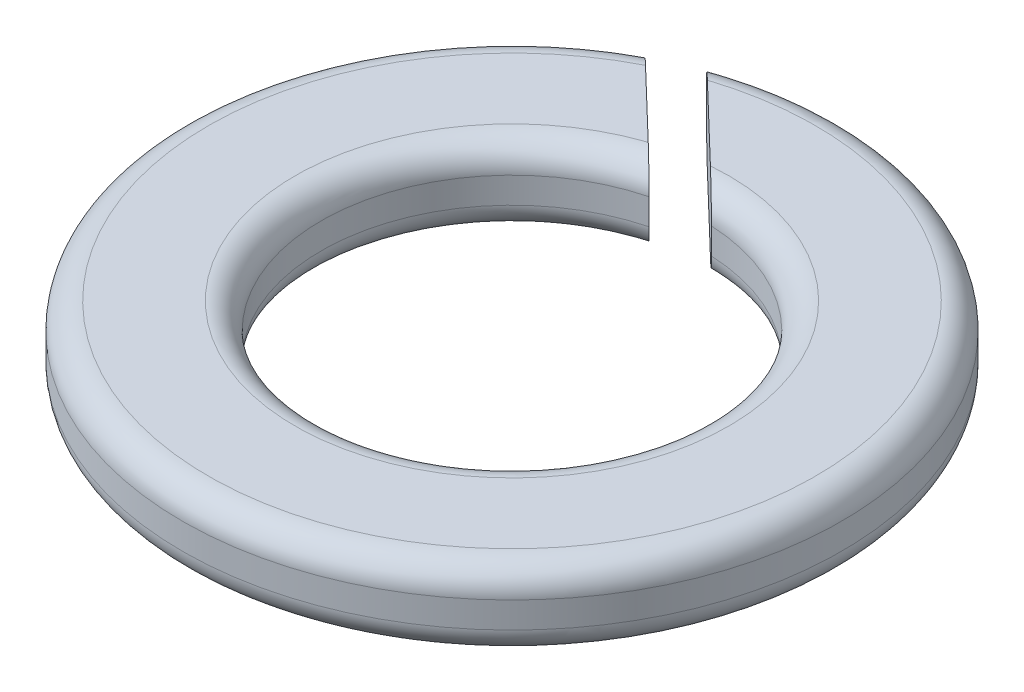
ISO-10303-21;
HEADER;
FILE_DESCRIPTION(('STEP AP214'),'2;1');
FILE_NAME('part.step','',(''),(''),'','','');
FILE_SCHEMA(('AUTOMOTIVE_DESIGN { 1 0 10303 214 1 1 1 1 }'));
ENDSEC;
DATA;
#1=APPLICATION_CONTEXT('core data for automotive mechanical design processes');
#2=APPLICATION_PROTOCOL_DEFINITION('international standard','automotive_design',2000,#1);
#3=PRODUCT_CONTEXT('',#1,'mechanical');
#4=PRODUCT('Part','Part','',(#3));
#5=PRODUCT_RELATED_PRODUCT_CATEGORY('part','',(#4));
#6=PRODUCT_DEFINITION_FORMATION('','',#4);
#7=PRODUCT_DEFINITION_CONTEXT('part definition',#1,'design');
#8=PRODUCT_DEFINITION('design','',#6,#7);
#9=PRODUCT_DEFINITION_SHAPE('','',#8);
#10=(LENGTH_UNIT() NAMED_UNIT(*) SI_UNIT(.MILLI.,.METRE.));
#11=(NAMED_UNIT(*) PLANE_ANGLE_UNIT() SI_UNIT($,.RADIAN.));
#12=(NAMED_UNIT(*) SI_UNIT($,.STERADIAN.) SOLID_ANGLE_UNIT());
#13=UNCERTAINTY_MEASURE_WITH_UNIT(LENGTH_MEASURE(1.E-05),#10,'distance_accuracy_value','');
#14=(GEOMETRIC_REPRESENTATION_CONTEXT(3) GLOBAL_UNCERTAINTY_ASSIGNED_CONTEXT((#13)) GLOBAL_UNIT_ASSIGNED_CONTEXT((#10,
#11,#12)) REPRESENTATION_CONTEXT('',''));
#15=CARTESIAN_POINT('',(0.,0.,0.));
#16=DIRECTION('',(0.,0.,1.));
#17=DIRECTION('',(1.,0.,0.));
#18=AXIS2_PLACEMENT_3D('',#15,#16,#17);
#19=CARTESIAN_POINT('',(0.593322217837906,0.,-1.0328610161791));
#20=DIRECTION('',(-0.692531828189712,0.,0.721387321030953));
#21=DIRECTION('',(0.,1.,0.));
#22=AXIS2_PLACEMENT_3D('',#19,#20,#21);
#23=PLANE('',#22);
#24=CARTESIAN_POINT('',(-0.549745919114708,0.3,-2.1302064276536));
#25=CARTESIAN_POINT('',(-0.549745919114708,0.238292872043772,-2.1302064276536));
#26=CARTESIAN_POINT('',(-0.571810228670032,0.178640490645868,-2.15138816482671));
#27=CARTESIAN_POINT('',(-0.592207092247999,0.123496164356241,-2.17096915386156));
#28=CARTESIAN_POINT('',(-0.629338967775897,0.0813366596468253,-2.20661575436834));
#29=CARTESIAN_POINT('',(-0.700976021927212,0.,-2.27538732635361));
#30=CARTESIAN_POINT('',(-0.798530547889687,0.,-2.36903967127758));
#31=B_SPLINE_CURVE_WITH_KNOTS('',2,(#24,#25,#26,#27,#28,#29,#30),.UNSPECIFIED.,.F.,.F.,(3,2,2,
3),(0.,0.25,0.5,1.),.UNSPECIFIED.);
#32=CARTESIAN_POINT('',(-0.549745919114707,0.3,-2.13020642765361));
#33=VERTEX_POINT('',#32);
#34=CARTESIAN_POINT('',(-0.798530547889687,0.,-2.36903967127758));
#35=VERTEX_POINT('',#34);
#36=EDGE_CURVE('E130',#33,#35,#31,.T.);
#37=ORIENTED_EDGE('',*,*,#36,.T.);
#38=DIRECTION('',(0.721387321030953,0.,0.692531828189712));
#39=VECTOR('',#38,1.);
#40=CARTESIAN_POINT('',(0.593322217837906,0.,-1.0328610161791));
#41=LINE('',#40,#39);
#42=CARTESIAN_POINT('',(-1.58260840657755,0.,-3.12175441561793));
#43=VERTEX_POINT('',#42);
#44=EDGE_CURVE('E127',#43,#35,#41,.T.);
#45=ORIENTED_EDGE('',*,*,#44,.F.);
#46=CARTESIAN_POINT('',(-1.58260840657755,0.,-3.12175441561793));
#47=CARTESIAN_POINT('',(-1.62616472047488,0.,-3.16356847695937));
#48=CARTESIAN_POINT('',(-1.66788251234681,0.0217214850961454,-3.20361755715641));
#49=CARTESIAN_POINT('',(-1.70888620140039,0.0430711534438573,-3.24298109864785));
#50=CARTESIAN_POINT('',(-1.74179588572183,0.084782734309142,-3.27457439559644));
#51=CARTESIAN_POINT('',(-1.77374416978038,0.125275782525553,-3.30524474829264));
#52=CARTESIAN_POINT('',(-1.79245412222487,0.182479272243945,-3.32320630263936));
#53=CARTESIAN_POINT('',(-1.81079363724819,0.238550192904411,-3.34081223706174));
#54=CARTESIAN_POINT('',(-1.81079363724819,0.3,-3.34081223706174));
#55=B_SPLINE_CURVE_WITH_KNOTS('',2,(#46,#47,#48,#49,#50,#51,#52,#53,#54),.UNSPECIFIED.,.F.,.F.,
(3,2,2,2,3),(0.,0.25,0.5,0.75,1.),.UNSPECIFIED.);
#56=CARTESIAN_POINT('',(-1.81079363724819,0.3,-3.34081223706174));
#57=VERTEX_POINT('',#56);
#58=EDGE_CURVE('E106',#43,#57,#55,.T.);
#59=ORIENTED_EDGE('',*,*,#58,.T.);
#60=DIRECTION('',(0.,-1.,0.));
#61=VECTOR('',#60,1.);
#62=CARTESIAN_POINT('',(-1.81079363724819,0.9,-3.34081223706174));
#63=LINE('',#62,#61);
#64=CARTESIAN_POINT('',(-1.81079363724819,0.6,-3.34081223706174));
#65=VERTEX_POINT('',#64);
#66=EDGE_CURVE('E257',#65,#57,#63,.T.);
#67=ORIENTED_EDGE('',*,*,#66,.F.);
#68=CARTESIAN_POINT('',(-1.81079363724819,0.6,-3.34081223706174));
#69=CARTESIAN_POINT('',(-1.81079363724819,0.659869786955904,-3.34081223706174));
#70=CARTESIAN_POINT('',(-1.79230807118462,0.717676118581319,-3.32306609364071));
#71=CARTESIAN_POINT('',(-1.7747236083619,0.772664604510765,-3.3061850093309));
#72=CARTESIAN_POINT('',(-1.74186074312703,0.815134271742733,-3.27463665870543));
#73=CARTESIAN_POINT('',(-1.71097715379939,0.855046061305205,-3.2449884129509));
#74=CARTESIAN_POINT('',(-1.66808237769919,0.878025014819113,-3.20380942789471));
#75=CARTESIAN_POINT('',(-1.62706170769484,0.9,-3.16442958469053));
#76=CARTESIAN_POINT('',(-1.58260840657755,0.9,-3.12175441561793));
#77=B_SPLINE_CURVE_WITH_KNOTS('',2,(#68,#69,#70,#71,#72,#73,#74,#75,#76),.UNSPECIFIED.,.F.,.F.,
(3,2,2,2,3),(0.,0.25,0.5,0.75,1.),.UNSPECIFIED.);
#78=CARTESIAN_POINT('',(-1.58260840657755,0.9,-3.12175441561793));
#79=VERTEX_POINT('',#78);
#80=EDGE_CURVE('E31',#65,#79,#77,.T.);
#81=ORIENTED_EDGE('',*,*,#80,.T.);
#82=DIRECTION('',(0.721387321030953,0.,0.692531828189712));
#83=VECTOR('',#82,1.);
#84=CARTESIAN_POINT('',(0.593322217837906,0.9,-1.0328610161791));
#85=LINE('',#84,#83);
#86=CARTESIAN_POINT('',(-0.798530547889687,0.9,-2.36903967127758));
#87=VERTEX_POINT('',#86);
#88=EDGE_CURVE('E273',#79,#87,#85,.T.);
#89=ORIENTED_EDGE('',*,*,#88,.T.);
#90=CARTESIAN_POINT('',(-0.798530547889687,0.9,-2.36903967127758));
#91=CARTESIAN_POINT('',(-0.702398788135294,0.9,-2.27675318191337));
#92=CARTESIAN_POINT('',(-0.629482383991013,0.81882452792996,-2.20675343393486));
#93=CARTESIAN_POINT('',(-0.593840935798757,0.779146057547061,-2.17253764367029));
#94=CARTESIAN_POINT('',(-0.571988208982686,0.721663595731595,-2.15155902592686));
#95=CARTESIAN_POINT('',(-0.549745919114708,0.663156408560589,-2.1302064276536));
#96=CARTESIAN_POINT('',(-0.549745919114708,0.6,-2.1302064276536));
#97=B_SPLINE_CURVE_WITH_KNOTS('',2,(#90,#91,#92,#93,#94,#95,#96),.UNSPECIFIED.,.F.,.F.,(3,2,2,
3),(0.,0.5,0.75,1.),.UNSPECIFIED.);
#98=CARTESIAN_POINT('',(-0.549745919114708,0.6,-2.13020642765361));
#99=VERTEX_POINT('',#98);
#100=EDGE_CURVE('E195',#87,#99,#97,.T.);
#101=ORIENTED_EDGE('',*,*,#100,.T.);
#102=DIRECTION('',(0.,-1.,0.));
#103=VECTOR('',#102,1.);
#104=CARTESIAN_POINT('',(-0.549745919114707,0.9,-2.13020642765361));
#105=LINE('',#104,#103);
#106=EDGE_CURVE('E200',#99,#33,#105,.T.);
#107=ORIENTED_EDGE('',*,*,#106,.T.);
#108=EDGE_LOOP('',(#37,#45,#59,#67,#81,#89,#101,#107));
#109=FACE_BOUND('',#108,.T.);
#110=ADVANCED_FACE('F17',(#109),#23,.F.);
#111=CARTESIAN_POINT('',(0.939588131932762,0.,-1.39355467669457));
#112=DIRECTION('',(0.692531828189712,0.,-0.721387321030953));
#113=DIRECTION('',(0.,-1.,0.));
#114=AXIS2_PLACEMENT_3D('',#111,#112,#113);
#115=PLANE('',#114);
#116=CARTESIAN_POINT('',(-0.204253008051566,0.,-2.49164217107952));
#117=CARTESIAN_POINT('',(-0.0969567383931656,0.,-2.38863775220746));
#118=CARTESIAN_POINT('',(-0.00861649510193875,0.0730108119148995,-2.30383111864788));
#119=CARTESIAN_POINT('',(0.038678053008725,0.112098471491797,-2.25842835246165));
#120=CARTESIAN_POINT('',(0.068260683071186,0.167039328004714,-2.23002902760168));
#121=CARTESIAN_POINT('',(0.102005583355745,0.229710352205813,-2.19763392332851));
#122=CARTESIAN_POINT('',(0.102005583355745,0.3,-2.19763392332851));
#123=B_SPLINE_CURVE_WITH_KNOTS('',2,(#116,#117,#118,#119,#120,#121,#122),.UNSPECIFIED.,.F.,.F.,
(3,2,2,3),(0.,0.5,0.75,1.),.UNSPECIFIED.);
#124=CARTESIAN_POINT('',(-0.204253008051564,0.,-2.49164217107952));
#125=VERTEX_POINT('',#124);
#126=CARTESIAN_POINT('',(0.102005583355745,0.3,-2.19763392332851));
#127=VERTEX_POINT('',#126);
#128=EDGE_CURVE('E45',#125,#127,#123,.T.);
#129=ORIENTED_EDGE('',*,*,#128,.T.);
#130=DIRECTION('',(0.,1.,0.));
#131=VECTOR('',#130,1.);
#132=CARTESIAN_POINT('',(0.102005583355745,0.9,-2.19763392332851));
#133=LINE('',#132,#131);
#134=CARTESIAN_POINT('',(0.102005583355743,0.6,-2.19763392332851));
#135=VERTEX_POINT('',#134);
#136=EDGE_CURVE('E222',#127,#135,#133,.T.);
#137=ORIENTED_EDGE('',*,*,#136,.T.);
#138=CARTESIAN_POINT('',(0.102005583355742,0.6,-2.19763392332851));
#139=CARTESIAN_POINT('',(0.102005583355742,0.668594130341303,-2.19763392332851));
#140=CARTESIAN_POINT('',(0.0684107004835456,0.73267844156295,-2.22988501088582));
#141=CARTESIAN_POINT('',(0.0407480877060247,0.785446581674718,-2.25644111915224));
#142=CARTESIAN_POINT('',(-0.00830269652094082,0.826727519443401,-2.30352987201013));
#143=CARTESIAN_POINT('',(-0.0953664316932296,0.9,-2.38711105777552));
#144=CARTESIAN_POINT('',(-0.204253008051566,0.9,-2.49164217107952));
#145=B_SPLINE_CURVE_WITH_KNOTS('',2,(#138,#139,#140,#141,#142,#143,#144),.UNSPECIFIED.,.F.,.F.,
(3,2,2,3),(0.,0.25,0.5,1.),.UNSPECIFIED.);
#146=CARTESIAN_POINT('',(-0.204253008051564,0.9,-2.49164217107952));
#147=VERTEX_POINT('',#146);
#148=EDGE_CURVE('E123',#135,#147,#145,.T.);
#149=ORIENTED_EDGE('',*,*,#148,.T.);
#150=DIRECTION('',(-0.721387321030953,0.,-0.692531828189712));
#151=VECTOR('',#150,1.);
#152=CARTESIAN_POINT('',(0.939588131932762,0.9,-1.39355467669457));
#153=LINE('',#152,#151);
#154=CARTESIAN_POINT('',(-1.07754268781631,0.9,-3.33000026365368));
#155=VERTEX_POINT('',#154);
#156=EDGE_CURVE('E149',#147,#155,#153,.T.);
#157=ORIENTED_EDGE('',*,*,#156,.T.);
#158=CARTESIAN_POINT('',(-1.07754268781631,0.9,-3.33000026365368));
#159=CARTESIAN_POINT('',(-1.17387298271746,0.9,-3.42247734675878));
#160=CARTESIAN_POINT('',(-1.24430597083907,0.818776308156964,-3.49009301535552));
#161=CARTESIAN_POINT('',(-1.27901853511499,0.778745596710211,-3.5234170770604));
#162=CARTESIAN_POINT('',(-1.29977581164189,0.720860874968146,-3.54334406252623));
#163=CARTESIAN_POINT('',(-1.32045840262741,0.663184424854354,-3.56319934987234));
#164=CARTESIAN_POINT('',(-1.32045840262741,0.6,-3.56319934987234));
#165=B_SPLINE_CURVE_WITH_KNOTS('',2,(#158,#159,#160,#161,#162,#163,#164),.UNSPECIFIED.,.F.,.F.,
(3,2,2,3),(0.,0.5,0.75,1.),.UNSPECIFIED.);
#166=CARTESIAN_POINT('',(-1.32045840262742,0.6,-3.56319934987234));
#167=VERTEX_POINT('',#166);
#168=EDGE_CURVE('E11',#155,#167,#165,.T.);
#169=ORIENTED_EDGE('',*,*,#168,.T.);
#170=DIRECTION('',(0.,1.,0.));
#171=VECTOR('',#170,1.);
#172=CARTESIAN_POINT('',(-1.32045840262742,0.9,-3.56319934987234));
#173=LINE('',#172,#171);
#174=CARTESIAN_POINT('',(-1.32045840262742,0.3,-3.56319934987234));
#175=VERTEX_POINT('',#174);
#176=EDGE_CURVE('E245',#175,#167,#173,.T.);
#177=ORIENTED_EDGE('',*,*,#176,.F.);
#178=CARTESIAN_POINT('',(-1.32045840262742,0.3,-3.56319934987234));
#179=CARTESIAN_POINT('',(-1.32045840262742,0.238495366538767,-3.56319934987234));
#180=CARTESIAN_POINT('',(-1.29973015442705,0.179225734398645,-3.54330023159999));
#181=CARTESIAN_POINT('',(-1.28026374656089,0.123564164633333,-3.52461248004847));
#182=CARTESIAN_POINT('',(-1.2445079377227,0.0814589579590288,-3.49028690356381));
#183=CARTESIAN_POINT('',(-1.21141165698653,0.04248554955834,-3.45851447405708));
#184=CARTESIAN_POINT('',(-1.16646410077022,0.0206156639467661,-3.41536482008943));
#185=CARTESIAN_POINT('',(-1.12409425345409,0.,-3.37468976666595));
#186=CARTESIAN_POINT('',(-1.07754268781631,0.,-3.33000026365368));
#187=B_SPLINE_CURVE_WITH_KNOTS('',2,(#178,#179,#180,#181,#182,#183,#184,#185,#186),
.UNSPECIFIED.,.F.,.F.,(3,2,2,2,3),(0.,0.25,0.5,0.75,1.),.UNSPECIFIED.);
#188=CARTESIAN_POINT('',(-1.07754268781631,0.,-3.33000026365368));
#189=VERTEX_POINT('',#188);
#190=EDGE_CURVE('E93',#175,#189,#187,.T.);
#191=ORIENTED_EDGE('',*,*,#190,.T.);
#192=DIRECTION('',(-0.721387321030953,0.,-0.692531828189712));
#193=VECTOR('',#192,1.);
#194=CARTESIAN_POINT('',(0.939588131932762,0.,-1.39355467669457));
#195=LINE('',#194,#193);
#196=EDGE_CURVE('E140',#125,#189,#195,.T.);
#197=ORIENTED_EDGE('',*,*,#196,.F.);
#198=EDGE_LOOP('',(#129,#137,#149,#157,#169,#177,#191,#197));
#199=FACE_BOUND('',#198,.T.);
#200=ADVANCED_FACE('F19',(#199),#115,.F.);
#201=CARTESIAN_POINT('',(0.,0.6,0.));
#202=DIRECTION('',(0.,1.,0.));
#203=DIRECTION('',(0.,0.,1.));
#204=AXIS2_PLACEMENT_3D('',#201,#202,#203);
#205=TOROIDAL_SURFACE('',#204,3.5,0.3);
#206=ORIENTED_EDGE('',*,*,#80,.F.);
#207=CARTESIAN_POINT('',(0.,0.6,0.));
#208=DIRECTION('',(0.,-1.,0.));
#209=DIRECTION('',(0.,0.,1.));
#210=AXIS2_PLACEMENT_3D('',#207,#208,#209);
#211=CIRCLE('',#210,3.8);
#212=EDGE_CURVE('E265',#167,#65,#211,.T.);
#213=ORIENTED_EDGE('',*,*,#212,.F.);
#214=ORIENTED_EDGE('',*,*,#168,.F.);
#215=CARTESIAN_POINT('',(0.,0.9,0.));
#216=DIRECTION('',(0.,1.,0.));
#217=DIRECTION('',(0.,0.,1.));
#218=AXIS2_PLACEMENT_3D('',#215,#216,#217);
#219=CIRCLE('',#218,3.5);
#220=EDGE_CURVE('E277',#79,#155,#219,.T.);
#221=ORIENTED_EDGE('',*,*,#220,.F.);
#222=EDGE_LOOP('',(#206,#213,#214,#221));
#223=FACE_BOUND('',#222,.T.);
#224=ADVANCED_FACE('F213',(#223),#205,.T.);
#225=CARTESIAN_POINT('',(0.,0.3,0.));
#226=DIRECTION('',(0.,1.,0.));
#227=DIRECTION('',(0.,0.,1.));
#228=AXIS2_PLACEMENT_3D('',#225,#226,#227);
#229=TOROIDAL_SURFACE('',#228,3.5,0.3);
#230=ORIENTED_EDGE('',*,*,#58,.F.);
#231=CARTESIAN_POINT('',(0.,0.,0.));
#232=DIRECTION('',(0.,-1.,0.));
#233=DIRECTION('',(0.,0.,1.));
#234=AXIS2_PLACEMENT_3D('',#231,#232,#233);
#235=CIRCLE('',#234,3.5);
#236=EDGE_CURVE('E118',#189,#43,#235,.T.);
#237=ORIENTED_EDGE('',*,*,#236,.F.);
#238=ORIENTED_EDGE('',*,*,#190,.F.);
#239=CARTESIAN_POINT('',(0.,0.3,0.));
#240=DIRECTION('',(0.,1.,0.));
#241=DIRECTION('',(0.,0.,1.));
#242=AXIS2_PLACEMENT_3D('',#239,#240,#241);
#243=CIRCLE('',#242,3.8);
#244=EDGE_CURVE('E120',#57,#175,#243,.T.);
#245=ORIENTED_EDGE('',*,*,#244,.F.);
#246=EDGE_LOOP('',(#230,#237,#238,#245));
#247=FACE_BOUND('',#246,.T.);
#248=ADVANCED_FACE('F116',(#247),#229,.T.);
#249=CARTESIAN_POINT('',(0.,0.6,0.));
#250=DIRECTION('',(0.,1.,0.));
#251=DIRECTION('',(0.,0.,1.));
#252=AXIS2_PLACEMENT_3D('',#249,#250,#251);
#253=TOROIDAL_SURFACE('',#252,2.5,0.3);
#254=ORIENTED_EDGE('',*,*,#100,.F.);
#255=CARTESIAN_POINT('',(0.,0.9,0.));
#256=DIRECTION('',(0.,-1.,0.));
#257=DIRECTION('',(0.,0.,1.));
#258=AXIS2_PLACEMENT_3D('',#255,#256,#257);
#259=CIRCLE('',#258,2.5);
#260=EDGE_CURVE('E142',#147,#87,#259,.T.);
#261=ORIENTED_EDGE('',*,*,#260,.F.);
#262=ORIENTED_EDGE('',*,*,#148,.F.);
#263=CARTESIAN_POINT('',(0.,0.6,0.));
#264=DIRECTION('',(0.,1.,0.));
#265=DIRECTION('',(0.,0.,1.));
#266=AXIS2_PLACEMENT_3D('',#263,#264,#265);
#267=CIRCLE('',#266,2.2);
#268=EDGE_CURVE('E231',#99,#135,#267,.T.);
#269=ORIENTED_EDGE('',*,*,#268,.F.);
#270=EDGE_LOOP('',(#254,#261,#262,#269));
#271=FACE_BOUND('',#270,.T.);
#272=ADVANCED_FACE('F202',(#271),#253,.T.);
#273=CARTESIAN_POINT('',(0.,0.3,0.));
#274=DIRECTION('',(0.,1.,0.));
#275=DIRECTION('',(0.,0.,1.));
#276=AXIS2_PLACEMENT_3D('',#273,#274,#275);
#277=TOROIDAL_SURFACE('',#276,2.5,0.3);
#278=ORIENTED_EDGE('',*,*,#36,.F.);
#279=CARTESIAN_POINT('',(0.,0.3,0.));
#280=DIRECTION('',(0.,-1.,0.));
#281=DIRECTION('',(0.,0.,1.));
#282=AXIS2_PLACEMENT_3D('',#279,#280,#281);
#283=CIRCLE('',#282,2.2);
#284=EDGE_CURVE('E230',#127,#33,#283,.T.);
#285=ORIENTED_EDGE('',*,*,#284,.F.);
#286=ORIENTED_EDGE('',*,*,#128,.F.);
#287=CARTESIAN_POINT('',(0.,0.,0.));
#288=DIRECTION('',(0.,1.,0.));
#289=DIRECTION('',(0.,0.,1.));
#290=AXIS2_PLACEMENT_3D('',#287,#288,#289);
#291=CIRCLE('',#290,2.5);
#292=EDGE_CURVE('E136',#35,#125,#291,.T.);
#293=ORIENTED_EDGE('',*,*,#292,.F.);
#294=EDGE_LOOP('',(#278,#285,#286,#293));
#295=FACE_BOUND('',#294,.T.);
#296=ADVANCED_FACE('F211',(#295),#277,.T.);
#297=CARTESIAN_POINT('',(0.,0.9,0.));
#298=DIRECTION('',(0.,-1.,0.));
#299=DIRECTION('',(0.,0.,-1.));
#300=AXIS2_PLACEMENT_3D('',#297,#298,#299);
#301=CYLINDRICAL_SURFACE('',#300,2.2);
#302=ORIENTED_EDGE('',*,*,#106,.F.);
#303=ORIENTED_EDGE('',*,*,#268,.T.);
#304=ORIENTED_EDGE('',*,*,#136,.F.);
#305=ORIENTED_EDGE('',*,*,#284,.T.);
#306=EDGE_LOOP('',(#302,#303,#304,#305));
#307=FACE_BOUND('',#306,.T.);
#308=ADVANCED_FACE('F170',(#307),#301,.F.);
#309=CARTESIAN_POINT('',(0.,0.9,0.));
#310=DIRECTION('',(0.,-1.,0.));
#311=DIRECTION('',(0.,0.,-1.));
#312=AXIS2_PLACEMENT_3D('',#309,#310,#311);
#313=CYLINDRICAL_SURFACE('',#312,3.8);
#314=ORIENTED_EDGE('',*,*,#212,.T.);
#315=ORIENTED_EDGE('',*,*,#66,.T.);
#316=ORIENTED_EDGE('',*,*,#244,.T.);
#317=ORIENTED_EDGE('',*,*,#176,.T.);
#318=EDGE_LOOP('',(#314,#315,#316,#317));
#319=FACE_BOUND('',#318,.T.);
#320=ADVANCED_FACE('F168',(#319),#313,.T.);
#321=CARTESIAN_POINT('',(0.,0.,0.));
#322=DIRECTION('',(0.,1.,0.));
#323=DIRECTION('',(1.,0.,0.));
#324=AXIS2_PLACEMENT_3D('',#321,#322,#323);
#325=PLANE('',#324);
#326=ORIENTED_EDGE('',*,*,#236,.T.);
#327=ORIENTED_EDGE('',*,*,#44,.T.);
#328=ORIENTED_EDGE('',*,*,#292,.T.);
#329=ORIENTED_EDGE('',*,*,#196,.T.);
#330=EDGE_LOOP('',(#326,#327,#328,#329));
#331=FACE_BOUND('',#330,.T.);
#332=ADVANCED_FACE('F139',(#331),#325,.F.);
#333=CARTESIAN_POINT('',(0.,0.9,0.));
#334=DIRECTION('',(0.,1.,0.));
#335=DIRECTION('',(1.,0.,0.));
#336=AXIS2_PLACEMENT_3D('',#333,#334,#335);
#337=PLANE('',#336);
#338=ORIENTED_EDGE('',*,*,#88,.F.);
#339=ORIENTED_EDGE('',*,*,#220,.T.);
#340=ORIENTED_EDGE('',*,*,#156,.F.);
#341=ORIENTED_EDGE('',*,*,#260,.T.);
#342=EDGE_LOOP('',(#338,#339,#340,#341));
#343=FACE_BOUND('',#342,.T.);
#344=ADVANCED_FACE('F283',(#343),#337,.T.);
#345=CLOSED_SHELL('',(#110,#200,#224,#248,#272,#296,#308,#320,#332,#344));
#346=MANIFOLD_SOLID_BREP('B1',#345);
#347=ADVANCED_BREP_SHAPE_REPRESENTATION('',(#18,#346),#14);
#348=SHAPE_DEFINITION_REPRESENTATION(#9,#347);
ENDSEC;
END-ISO-10303-21;
